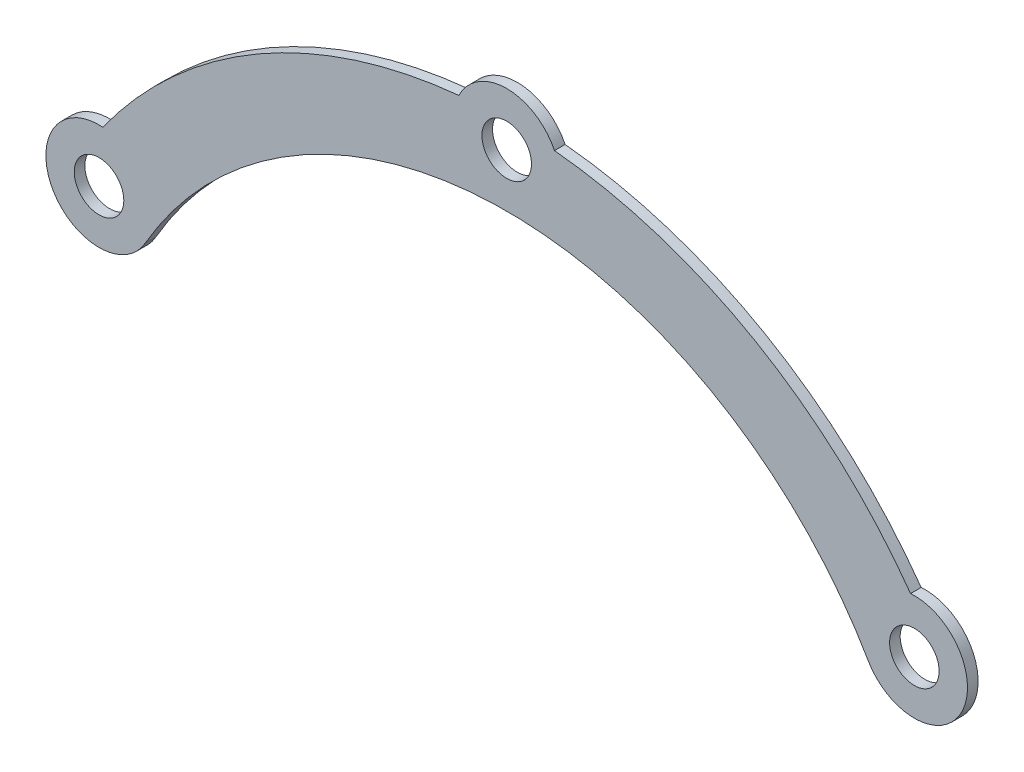
ISO-10303-21;
HEADER;
FILE_DESCRIPTION(('STEP AP214'),'2;1');
FILE_NAME('part.step','',(''),(''),'','','');
FILE_SCHEMA(('AUTOMOTIVE_DESIGN { 1 0 10303 214 1 1 1 1 }'));
ENDSEC;
DATA;
#1=APPLICATION_CONTEXT('core data for automotive mechanical design processes');
#2=APPLICATION_PROTOCOL_DEFINITION('international standard','automotive_design',2000,#1);
#3=PRODUCT_CONTEXT('',#1,'mechanical');
#4=PRODUCT('Part','Part','',(#3));
#5=PRODUCT_RELATED_PRODUCT_CATEGORY('part','',(#4));
#6=PRODUCT_DEFINITION_FORMATION('','',#4);
#7=PRODUCT_DEFINITION_CONTEXT('part definition',#1,'design');
#8=PRODUCT_DEFINITION('design','',#6,#7);
#9=PRODUCT_DEFINITION_SHAPE('','',#8);
#10=(LENGTH_UNIT() NAMED_UNIT(*) SI_UNIT(.MILLI.,.METRE.));
#11=(NAMED_UNIT(*) PLANE_ANGLE_UNIT() SI_UNIT($,.RADIAN.));
#12=(NAMED_UNIT(*) SI_UNIT($,.STERADIAN.) SOLID_ANGLE_UNIT());
#13=UNCERTAINTY_MEASURE_WITH_UNIT(LENGTH_MEASURE(1.E-05),#10,'distance_accuracy_value','');
#14=(GEOMETRIC_REPRESENTATION_CONTEXT(3) GLOBAL_UNCERTAINTY_ASSIGNED_CONTEXT((#13)) GLOBAL_UNIT_ASSIGNED_CONTEXT((#10,
#11,#12)) REPRESENTATION_CONTEXT('',''));
#15=CARTESIAN_POINT('',(0.,0.,0.));
#16=DIRECTION('',(0.,0.,1.));
#17=DIRECTION('',(1.,0.,0.));
#18=AXIS2_PLACEMENT_3D('',#15,#16,#17);
#19=CARTESIAN_POINT('',(-36.5700877383074,21.1137499999999,1.905));
#20=DIRECTION('',(0.,0.,1.));
#21=DIRECTION('',(1.,0.,0.));
#22=AXIS2_PLACEMENT_3D('',#19,#20,#21);
#23=PLANE('',#22);
#24=CARTESIAN_POINT('',(73.1401754766153,42.227499999999,1.905));
#25=DIRECTION('',(0.,0.,1.));
#26=DIRECTION('',(1.,0.,0.));
#27=AXIS2_PLACEMENT_3D('',#24,#25,#26);
#28=CIRCLE('',#27,4.44499999999978);
#29=CARTESIAN_POINT('',(77.5851754766151,42.227499999999,1.905));
#30=VERTEX_POINT('',#29);
#31=EDGE_CURVE('E185',#30,#30,#28,.T.);
#32=ORIENTED_EDGE('',*,*,#31,.F.);
#33=EDGE_LOOP('',(#32));
#34=FACE_BOUND('',#33,.T.);
#35=CARTESIAN_POINT('',(0.,0.,1.905));
#36=DIRECTION('',(0.,0.,-1.));
#37=DIRECTION('',(1.,0.,0.));
#38=AXIS2_PLACEMENT_3D('',#35,#36,#37);
#39=CIRCLE('',#38,74.9249999999997);
#40=CARTESIAN_POINT('',(-64.8869533785491,37.4624999999998,1.905));
#41=VERTEX_POINT('',#40);
#42=CARTESIAN_POINT('',(64.8869533785493,37.4624999999992,1.905));
#43=VERTEX_POINT('',#42);
#44=EDGE_CURVE('E130',#41,#43,#39,.T.);
#45=ORIENTED_EDGE('',*,*,#44,.T.);
#46=CARTESIAN_POINT('',(73.1401754766153,42.227499999999,1.905));
#47=DIRECTION('',(0.,0.,1.));
#48=DIRECTION('',(1.,0.,0.));
#49=AXIS2_PLACEMENT_3D('',#46,#47,#48);
#50=CIRCLE('',#49,9.5300000000002);
#51=CARTESIAN_POINT('',(72.4571491026733,51.7329918322242,1.905));
#52=VERTEX_POINT('',#51);
#53=EDGE_CURVE('E88',#43,#52,#50,.T.);
#54=ORIENTED_EDGE('',*,*,#53,.T.);
#55=CARTESIAN_POINT('',(0.,0.,1.905));
#56=DIRECTION('',(0.,0.,1.));
#57=DIRECTION('',(1.,0.,0.));
#58=AXIS2_PLACEMENT_3D('',#55,#56,#57);
#59=CIRCLE('',#58,89.03);
#60=CARTESIAN_POINT('',(8.57351058914359,88.6162277248239,1.905));
#61=VERTEX_POINT('',#60);
#62=EDGE_CURVE('E101',#52,#61,#59,.T.);
#63=ORIENTED_EDGE('',*,*,#62,.T.);
#64=CARTESIAN_POINT('',(0.,84.455,1.905));
#65=DIRECTION('',(0.,0.,1.));
#66=DIRECTION('',(1.,0.,0.));
#67=AXIS2_PLACEMENT_3D('',#64,#65,#66);
#68=CIRCLE('',#67,9.53000000000001);
#69=CARTESIAN_POINT('',(-8.57351058914359,88.6162277248239,1.905));
#70=VERTEX_POINT('',#69);
#71=EDGE_CURVE('E95',#61,#70,#68,.T.);
#72=ORIENTED_EDGE('',*,*,#71,.T.);
#73=CARTESIAN_POINT('',(0.,0.,1.905));
#74=DIRECTION('',(0.,0.,1.));
#75=DIRECTION('',(1.,0.,0.));
#76=AXIS2_PLACEMENT_3D('',#73,#74,#75);
#77=CIRCLE('',#76,89.03);
#78=CARTESIAN_POINT('',(-72.4571491026727,51.732991832225,1.905));
#79=VERTEX_POINT('',#78);
#80=EDGE_CURVE('E99',#70,#79,#77,.T.);
#81=ORIENTED_EDGE('',*,*,#80,.T.);
#82=CARTESIAN_POINT('',(-73.1401754766148,42.2274999999998,1.905));
#83=DIRECTION('',(0.,0.,1.));
#84=DIRECTION('',(1.,0.,0.));
#85=AXIS2_PLACEMENT_3D('',#82,#83,#84);
#86=CIRCLE('',#85,9.53000000000007);
#87=EDGE_CURVE('E51',#79,#41,#86,.T.);
#88=ORIENTED_EDGE('',*,*,#87,.T.);
#89=EDGE_LOOP('',(#45,#54,#63,#72,#81,#88));
#90=FACE_BOUND('',#89,.T.);
#91=CARTESIAN_POINT('',(-73.1401754766148,42.2274999999998,1.905));
#92=DIRECTION('',(0.,0.,1.));
#93=DIRECTION('',(1.,0.,0.));
#94=AXIS2_PLACEMENT_3D('',#91,#92,#93);
#95=CIRCLE('',#94,4.44499999999997);
#96=CARTESIAN_POINT('',(-68.6951754766148,42.2274999999998,1.905));
#97=VERTEX_POINT('',#96);
#98=EDGE_CURVE('E123',#97,#97,#95,.T.);
#99=ORIENTED_EDGE('',*,*,#98,.F.);
#100=EDGE_LOOP('',(#99));
#101=FACE_BOUND('',#100,.T.);
#102=CARTESIAN_POINT('',(0.,84.455,1.905));
#103=DIRECTION('',(0.,0.,1.));
#104=DIRECTION('',(1.,0.,0.));
#105=AXIS2_PLACEMENT_3D('',#102,#103,#104);
#106=CIRCLE('',#105,4.445);
#107=CARTESIAN_POINT('',(4.445,84.455,1.905));
#108=VERTEX_POINT('',#107);
#109=EDGE_CURVE('E176',#108,#108,#106,.T.);
#110=ORIENTED_EDGE('',*,*,#109,.F.);
#111=EDGE_LOOP('',(#110));
#112=FACE_BOUND('',#111,.T.);
#113=ADVANCED_FACE('F34',(#34,#90,#101,#112),#23,.T.);
#114=CARTESIAN_POINT('',(-36.5700877383074,21.1137499999999,0.));
#115=DIRECTION('',(0.,0.,1.));
#116=DIRECTION('',(1.,0.,0.));
#117=AXIS2_PLACEMENT_3D('',#114,#115,#116);
#118=PLANE('',#117);
#119=CARTESIAN_POINT('',(0.,0.,0.));
#120=DIRECTION('',(0.,0.,-1.));
#121=DIRECTION('',(1.,0.,0.));
#122=AXIS2_PLACEMENT_3D('',#119,#120,#121);
#123=CIRCLE('',#122,74.9249999999997);
#124=CARTESIAN_POINT('',(-64.8869533785491,37.4624999999998,0.));
#125=VERTEX_POINT('',#124);
#126=CARTESIAN_POINT('',(64.8869533785493,37.4624999999992,0.));
#127=VERTEX_POINT('',#126);
#128=EDGE_CURVE('E119',#125,#127,#123,.T.);
#129=ORIENTED_EDGE('',*,*,#128,.F.);
#130=CARTESIAN_POINT('',(-73.1401754766148,42.2274999999998,0.));
#131=DIRECTION('',(0.,0.,1.));
#132=DIRECTION('',(1.,0.,0.));
#133=AXIS2_PLACEMENT_3D('',#130,#131,#132);
#134=CIRCLE('',#133,9.53000000000007);
#135=CARTESIAN_POINT('',(-72.4571491026727,51.732991832225,0.));
#136=VERTEX_POINT('',#135);
#137=EDGE_CURVE('E80',#136,#125,#134,.T.);
#138=ORIENTED_EDGE('',*,*,#137,.F.);
#139=CARTESIAN_POINT('',(0.,0.,0.));
#140=DIRECTION('',(0.,0.,1.));
#141=DIRECTION('',(1.,0.,0.));
#142=AXIS2_PLACEMENT_3D('',#139,#140,#141);
#143=CIRCLE('',#142,89.03);
#144=CARTESIAN_POINT('',(-8.57351058914359,88.6162277248239,0.));
#145=VERTEX_POINT('',#144);
#146=EDGE_CURVE('E74',#145,#136,#143,.T.);
#147=ORIENTED_EDGE('',*,*,#146,.F.);
#148=CARTESIAN_POINT('',(0.,84.455,0.));
#149=DIRECTION('',(0.,0.,1.));
#150=DIRECTION('',(1.,0.,0.));
#151=AXIS2_PLACEMENT_3D('',#148,#149,#150);
#152=CIRCLE('',#151,9.53000000000001);
#153=CARTESIAN_POINT('',(8.57351058914359,88.6162277248239,0.));
#154=VERTEX_POINT('',#153);
#155=EDGE_CURVE('E109',#154,#145,#152,.T.);
#156=ORIENTED_EDGE('',*,*,#155,.F.);
#157=CARTESIAN_POINT('',(0.,0.,0.));
#158=DIRECTION('',(0.,0.,1.));
#159=DIRECTION('',(1.,0.,0.));
#160=AXIS2_PLACEMENT_3D('',#157,#158,#159);
#161=CIRCLE('',#160,89.03);
#162=CARTESIAN_POINT('',(72.4571491026733,51.7329918322242,0.));
#163=VERTEX_POINT('',#162);
#164=EDGE_CURVE('E125',#163,#154,#161,.T.);
#165=ORIENTED_EDGE('',*,*,#164,.F.);
#166=CARTESIAN_POINT('',(73.1401754766153,42.227499999999,0.));
#167=DIRECTION('',(0.,0.,1.));
#168=DIRECTION('',(1.,0.,0.));
#169=AXIS2_PLACEMENT_3D('',#166,#167,#168);
#170=CIRCLE('',#169,9.5300000000002);
#171=EDGE_CURVE('E122',#127,#163,#170,.T.);
#172=ORIENTED_EDGE('',*,*,#171,.F.);
#173=EDGE_LOOP('',(#129,#138,#147,#156,#165,#172));
#174=FACE_BOUND('',#173,.T.);
#175=CARTESIAN_POINT('',(-73.1401754766148,42.2274999999998,0.));
#176=DIRECTION('',(0.,0.,1.));
#177=DIRECTION('',(1.,0.,0.));
#178=AXIS2_PLACEMENT_3D('',#175,#176,#177);
#179=CIRCLE('',#178,4.44499999999997);
#180=CARTESIAN_POINT('',(-68.6951754766148,42.2274999999998,0.));
#181=VERTEX_POINT('',#180);
#182=EDGE_CURVE('E188',#181,#181,#179,.T.);
#183=ORIENTED_EDGE('',*,*,#182,.T.);
#184=EDGE_LOOP('',(#183));
#185=FACE_BOUND('',#184,.T.);
#186=CARTESIAN_POINT('',(73.1401754766153,42.227499999999,0.));
#187=DIRECTION('',(0.,0.,1.));
#188=DIRECTION('',(1.,0.,0.));
#189=AXIS2_PLACEMENT_3D('',#186,#187,#188);
#190=CIRCLE('',#189,4.44499999999978);
#191=CARTESIAN_POINT('',(77.5851754766151,42.227499999999,0.));
#192=VERTEX_POINT('',#191);
#193=EDGE_CURVE('E182',#192,#192,#190,.T.);
#194=ORIENTED_EDGE('',*,*,#193,.T.);
#195=EDGE_LOOP('',(#194));
#196=FACE_BOUND('',#195,.T.);
#197=CARTESIAN_POINT('',(0.,84.455,0.));
#198=DIRECTION('',(0.,0.,1.));
#199=DIRECTION('',(1.,0.,0.));
#200=AXIS2_PLACEMENT_3D('',#197,#198,#199);
#201=CIRCLE('',#200,4.445);
#202=CARTESIAN_POINT('',(4.445,84.455,0.));
#203=VERTEX_POINT('',#202);
#204=EDGE_CURVE('E179',#203,#203,#201,.T.);
#205=ORIENTED_EDGE('',*,*,#204,.T.);
#206=EDGE_LOOP('',(#205));
#207=FACE_BOUND('',#206,.T.);
#208=ADVANCED_FACE('F139',(#174,#185,#196,#207),#118,.F.);
#209=CARTESIAN_POINT('',(0.,0.,1.905));
#210=DIRECTION('',(0.,0.,-1.));
#211=DIRECTION('',(-1.,0.,0.));
#212=AXIS2_PLACEMENT_3D('',#209,#210,#211);
#213=CYLINDRICAL_SURFACE('',#212,74.9249999999997);
#214=ORIENTED_EDGE('',*,*,#128,.T.);
#215=DIRECTION('',(0.,0.,-1.));
#216=VECTOR('',#215,1.);
#217=CARTESIAN_POINT('',(64.8869533785493,37.4624999999992,1.905));
#218=LINE('',#217,#216);
#219=EDGE_CURVE('E11',#43,#127,#218,.T.);
#220=ORIENTED_EDGE('',*,*,#219,.F.);
#221=ORIENTED_EDGE('',*,*,#44,.F.);
#222=DIRECTION('',(0.,0.,-1.));
#223=VECTOR('',#222,1.);
#224=CARTESIAN_POINT('',(-64.8869533785491,37.4624999999998,1.905));
#225=LINE('',#224,#223);
#226=EDGE_CURVE('E115',#41,#125,#225,.T.);
#227=ORIENTED_EDGE('',*,*,#226,.T.);
#228=EDGE_LOOP('',(#214,#220,#221,#227));
#229=FACE_BOUND('',#228,.T.);
#230=ADVANCED_FACE('F36',(#229),#213,.F.);
#231=CARTESIAN_POINT('',(73.1401754766153,42.227499999999,1.905));
#232=DIRECTION('',(0.,0.,-1.));
#233=DIRECTION('',(-1.,0.,0.));
#234=AXIS2_PLACEMENT_3D('',#231,#232,#233);
#235=CYLINDRICAL_SURFACE('',#234,9.5300000000002);
#236=ORIENTED_EDGE('',*,*,#171,.T.);
#237=DIRECTION('',(0.,0.,-1.));
#238=VECTOR('',#237,1.);
#239=CARTESIAN_POINT('',(72.4571491026733,51.7329918322242,1.905));
#240=LINE('',#239,#238);
#241=EDGE_CURVE('E43',#52,#163,#240,.T.);
#242=ORIENTED_EDGE('',*,*,#241,.F.);
#243=ORIENTED_EDGE('',*,*,#53,.F.);
#244=ORIENTED_EDGE('',*,*,#219,.T.);
#245=EDGE_LOOP('',(#236,#242,#243,#244));
#246=FACE_BOUND('',#245,.T.);
#247=ADVANCED_FACE('F238',(#246),#235,.T.);
#248=CARTESIAN_POINT('',(0.,0.,1.905));
#249=DIRECTION('',(0.,0.,-1.));
#250=DIRECTION('',(-1.,0.,0.));
#251=AXIS2_PLACEMENT_3D('',#248,#249,#250);
#252=CYLINDRICAL_SURFACE('',#251,89.03);
#253=ORIENTED_EDGE('',*,*,#164,.T.);
#254=DIRECTION('',(0.,0.,-1.));
#255=VECTOR('',#254,1.);
#256=CARTESIAN_POINT('',(8.57351058914359,88.6162277248239,1.905));
#257=LINE('',#256,#255);
#258=EDGE_CURVE('E110',#61,#154,#257,.T.);
#259=ORIENTED_EDGE('',*,*,#258,.F.);
#260=ORIENTED_EDGE('',*,*,#62,.F.);
#261=ORIENTED_EDGE('',*,*,#241,.T.);
#262=EDGE_LOOP('',(#253,#259,#260,#261));
#263=FACE_BOUND('',#262,.T.);
#264=ADVANCED_FACE('F136',(#263),#252,.T.);
#265=CARTESIAN_POINT('',(0.,84.455,1.905));
#266=DIRECTION('',(0.,0.,-1.));
#267=DIRECTION('',(-1.,0.,0.));
#268=AXIS2_PLACEMENT_3D('',#265,#266,#267);
#269=CYLINDRICAL_SURFACE('',#268,9.53000000000001);
#270=ORIENTED_EDGE('',*,*,#155,.T.);
#271=DIRECTION('',(0.,0.,-1.));
#272=VECTOR('',#271,1.);
#273=CARTESIAN_POINT('',(-8.57351058914359,88.6162277248239,1.905));
#274=LINE('',#273,#272);
#275=EDGE_CURVE('E106',#70,#145,#274,.T.);
#276=ORIENTED_EDGE('',*,*,#275,.F.);
#277=ORIENTED_EDGE('',*,*,#71,.F.);
#278=ORIENTED_EDGE('',*,*,#258,.T.);
#279=EDGE_LOOP('',(#270,#276,#277,#278));
#280=FACE_BOUND('',#279,.T.);
#281=ADVANCED_FACE('F107',(#280),#269,.T.);
#282=CARTESIAN_POINT('',(0.,0.,1.905));
#283=DIRECTION('',(0.,0.,-1.));
#284=DIRECTION('',(-1.,0.,0.));
#285=AXIS2_PLACEMENT_3D('',#282,#283,#284);
#286=CYLINDRICAL_SURFACE('',#285,89.03);
#287=ORIENTED_EDGE('',*,*,#146,.T.);
#288=DIRECTION('',(0.,0.,-1.));
#289=VECTOR('',#288,1.);
#290=CARTESIAN_POINT('',(-72.4571491026727,51.732991832225,1.905));
#291=LINE('',#290,#289);
#292=EDGE_CURVE('E111',#79,#136,#291,.T.);
#293=ORIENTED_EDGE('',*,*,#292,.F.);
#294=ORIENTED_EDGE('',*,*,#80,.F.);
#295=ORIENTED_EDGE('',*,*,#275,.T.);
#296=EDGE_LOOP('',(#287,#293,#294,#295));
#297=FACE_BOUND('',#296,.T.);
#298=ADVANCED_FACE('F113',(#297),#286,.T.);
#299=CARTESIAN_POINT('',(-73.1401754766148,42.2274999999998,1.905));
#300=DIRECTION('',(0.,0.,-1.));
#301=DIRECTION('',(-1.,0.,0.));
#302=AXIS2_PLACEMENT_3D('',#299,#300,#301);
#303=CYLINDRICAL_SURFACE('',#302,9.53000000000007);
#304=ORIENTED_EDGE('',*,*,#137,.T.);
#305=ORIENTED_EDGE('',*,*,#226,.F.);
#306=ORIENTED_EDGE('',*,*,#87,.F.);
#307=ORIENTED_EDGE('',*,*,#292,.T.);
#308=EDGE_LOOP('',(#304,#305,#306,#307));
#309=FACE_BOUND('',#308,.T.);
#310=ADVANCED_FACE('F144',(#309),#303,.T.);
#311=CARTESIAN_POINT('',(-73.1401754766148,42.2274999999998,1.905));
#312=DIRECTION('',(0.,0.,-1.));
#313=DIRECTION('',(-1.,0.,0.));
#314=AXIS2_PLACEMENT_3D('',#311,#312,#313);
#315=CYLINDRICAL_SURFACE('',#314,4.44499999999997);
#316=ORIENTED_EDGE('',*,*,#98,.T.);
#317=EDGE_LOOP('',(#316));
#318=FACE_BOUND('',#317,.T.);
#319=ORIENTED_EDGE('',*,*,#182,.F.);
#320=EDGE_LOOP('',(#319));
#321=FACE_BOUND('',#320,.T.);
#322=ADVANCED_FACE('F146',(#318,#321),#315,.F.);
#323=CARTESIAN_POINT('',(73.1401754766153,42.227499999999,1.905));
#324=DIRECTION('',(0.,0.,-1.));
#325=DIRECTION('',(-1.,0.,0.));
#326=AXIS2_PLACEMENT_3D('',#323,#324,#325);
#327=CYLINDRICAL_SURFACE('',#326,4.44499999999978);
#328=ORIENTED_EDGE('',*,*,#31,.T.);
#329=EDGE_LOOP('',(#328));
#330=FACE_BOUND('',#329,.T.);
#331=ORIENTED_EDGE('',*,*,#193,.F.);
#332=EDGE_LOOP('',(#331));
#333=FACE_BOUND('',#332,.T.);
#334=ADVANCED_FACE('F152',(#330,#333),#327,.F.);
#335=CARTESIAN_POINT('',(0.,84.455,1.905));
#336=DIRECTION('',(0.,0.,-1.));
#337=DIRECTION('',(-1.,0.,0.));
#338=AXIS2_PLACEMENT_3D('',#335,#336,#337);
#339=CYLINDRICAL_SURFACE('',#338,4.445);
#340=ORIENTED_EDGE('',*,*,#109,.T.);
#341=EDGE_LOOP('',(#340));
#342=FACE_BOUND('',#341,.T.);
#343=ORIENTED_EDGE('',*,*,#204,.F.);
#344=EDGE_LOOP('',(#343));
#345=FACE_BOUND('',#344,.T.);
#346=ADVANCED_FACE('F167',(#342,#345),#339,.F.);
#347=CLOSED_SHELL('',(#113,#208,#230,#247,#264,#281,#298,#310,#322,#334,#346));
#348=MANIFOLD_SOLID_BREP('B2',#347);
#349=ADVANCED_BREP_SHAPE_REPRESENTATION('',(#18,#348),#14);
#350=SHAPE_DEFINITION_REPRESENTATION(#9,#349);
ENDSEC;
END-ISO-10303-21;
